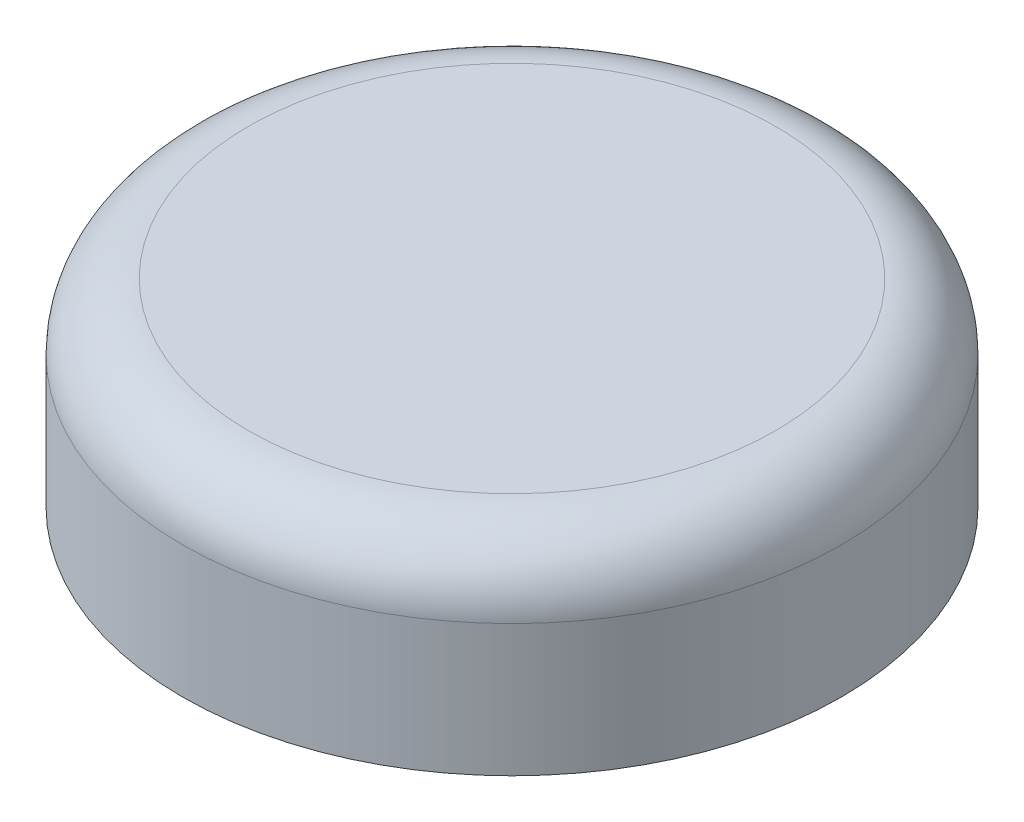
ISO-10303-21;
HEADER;
FILE_DESCRIPTION(('STEP AP214'),'2;1');
FILE_NAME('part.step','',(''),(''),'','','');
FILE_SCHEMA(('AUTOMOTIVE_DESIGN { 1 0 10303 214 1 1 1 1 }'));
ENDSEC;
DATA;
#1=APPLICATION_CONTEXT('core data for automotive mechanical design processes');
#2=APPLICATION_PROTOCOL_DEFINITION('international standard','automotive_design',2000,#1);
#3=PRODUCT_CONTEXT('',#1,'mechanical');
#4=PRODUCT('Part','Part','',(#3));
#5=PRODUCT_RELATED_PRODUCT_CATEGORY('part','',(#4));
#6=PRODUCT_DEFINITION_FORMATION('','',#4);
#7=PRODUCT_DEFINITION_CONTEXT('part definition',#1,'design');
#8=PRODUCT_DEFINITION('design','',#6,#7);
#9=PRODUCT_DEFINITION_SHAPE('','',#8);
#10=(LENGTH_UNIT() NAMED_UNIT(*) SI_UNIT(.MILLI.,.METRE.));
#11=(NAMED_UNIT(*) PLANE_ANGLE_UNIT() SI_UNIT($,.RADIAN.));
#12=(NAMED_UNIT(*) SI_UNIT($,.STERADIAN.) SOLID_ANGLE_UNIT());
#13=UNCERTAINTY_MEASURE_WITH_UNIT(LENGTH_MEASURE(1.E-05),#10,'distance_accuracy_value','');
#14=(GEOMETRIC_REPRESENTATION_CONTEXT(3) GLOBAL_UNCERTAINTY_ASSIGNED_CONTEXT((#13)) GLOBAL_UNIT_ASSIGNED_CONTEXT((#10,
#11,#12)) REPRESENTATION_CONTEXT('',''));
#15=CARTESIAN_POINT('',(0.,0.,0.));
#16=DIRECTION('',(0.,0.,1.));
#17=DIRECTION('',(1.,0.,0.));
#18=AXIS2_PLACEMENT_3D('',#15,#16,#17);
#19=CARTESIAN_POINT('',(0.,-4.5,0.));
#20=DIRECTION('',(0.,1.,0.));
#21=DIRECTION('',(0.,0.,1.));
#22=AXIS2_PLACEMENT_3D('',#19,#20,#21);
#23=CYLINDRICAL_SURFACE('',#22,2.4);
#24=DIRECTION('',(0.,-1.,0.));
#25=VECTOR('',#24,1.);
#26=CARTESIAN_POINT('',(-2.32379000772445,4.,-0.599999999999999));
#27=LINE('',#26,#25);
#28=CARTESIAN_POINT('',(-2.32379000772445,4.,-0.599999999999999));
#29=VERTEX_POINT('',#28);
#30=CARTESIAN_POINT('',(-2.32379000772445,-4.5,-0.599999999999999));
#31=VERTEX_POINT('',#30);
#32=EDGE_CURVE('E99',#29,#31,#27,.T.);
#33=ORIENTED_EDGE('',*,*,#32,.F.);
#34=CARTESIAN_POINT('',(0.,4.,0.));
#35=DIRECTION('',(0.,-1.,0.));
#36=DIRECTION('',(0.,0.,-1.));
#37=AXIS2_PLACEMENT_3D('',#34,#35,#36);
#38=CIRCLE('',#37,2.4);
#39=CARTESIAN_POINT('',(-0.599999999999999,4.,-2.32379000772445));
#40=VERTEX_POINT('',#39);
#41=EDGE_CURVE('E195',#29,#40,#38,.T.);
#42=ORIENTED_EDGE('',*,*,#41,.T.);
#43=DIRECTION('',(0.,-1.,0.));
#44=VECTOR('',#43,1.);
#45=CARTESIAN_POINT('',(-0.599999999999999,4.,-2.32379000772445));
#46=LINE('',#45,#44);
#47=CARTESIAN_POINT('',(-0.599999999999999,-4.5,-2.32379000772445));
#48=VERTEX_POINT('',#47);
#49=EDGE_CURVE('E163',#40,#48,#46,.T.);
#50=ORIENTED_EDGE('',*,*,#49,.T.);
#51=CARTESIAN_POINT('',(0.,-4.5,0.));
#52=DIRECTION('',(0.,-1.,0.));
#53=DIRECTION('',(0.,0.,-1.));
#54=AXIS2_PLACEMENT_3D('',#51,#52,#53);
#55=CIRCLE('',#54,2.4);
#56=EDGE_CURVE('E229',#31,#48,#55,.T.);
#57=ORIENTED_EDGE('',*,*,#56,.F.);
#58=EDGE_LOOP('',(#33,#42,#50,#57));
#59=FACE_BOUND('',#58,.T.);
#60=ADVANCED_FACE('F39',(#59),#23,.T.);
#61=CARTESIAN_POINT('',(-0.6,4.,2.32379000772445));
#62=VERTEX_POINT('',#61);
#63=CARTESIAN_POINT('',(-2.32379000772445,4.,0.600000000000001));
#64=VERTEX_POINT('',#63);
#65=EDGE_CURVE('E153',#62,#64,#38,.T.);
#66=ORIENTED_EDGE('',*,*,#65,.T.);
#67=DIRECTION('',(0.,-1.,0.));
#68=VECTOR('',#67,1.);
#69=CARTESIAN_POINT('',(-2.32379000772445,4.,0.600000000000001));
#70=LINE('',#69,#68);
#71=CARTESIAN_POINT('',(-2.32379000772445,-4.5,0.600000000000001));
#72=VERTEX_POINT('',#71);
#73=EDGE_CURVE('E143',#64,#72,#70,.T.);
#74=ORIENTED_EDGE('',*,*,#73,.T.);
#75=CARTESIAN_POINT('',(-0.6,-4.5,2.32379000772445));
#76=VERTEX_POINT('',#75);
#77=EDGE_CURVE('E335',#76,#72,#55,.T.);
#78=ORIENTED_EDGE('',*,*,#77,.F.);
#79=DIRECTION('',(0.,-1.,0.));
#80=VECTOR('',#79,1.);
#81=CARTESIAN_POINT('',(-0.6,4.,2.32379000772445));
#82=LINE('',#81,#80);
#83=EDGE_CURVE('E144',#62,#76,#82,.T.);
#84=ORIENTED_EDGE('',*,*,#83,.F.);
#85=EDGE_LOOP('',(#66,#74,#78,#84));
#86=FACE_BOUND('',#85,.T.);
#87=ADVANCED_FACE('F267',(#86),#23,.T.);
#88=DIRECTION('',(0.,-1.,0.));
#89=VECTOR('',#88,1.);
#90=CARTESIAN_POINT('',(2.32379000772445,4.,-0.599999999999999));
#91=LINE('',#90,#89);
#92=CARTESIAN_POINT('',(2.32379000772445,4.,-0.599999999999999));
#93=VERTEX_POINT('',#92);
#94=CARTESIAN_POINT('',(2.32379000772445,-4.5,-0.599999999999999));
#95=VERTEX_POINT('',#94);
#96=EDGE_CURVE('E210',#93,#95,#91,.T.);
#97=ORIENTED_EDGE('',*,*,#96,.T.);
#98=CARTESIAN_POINT('',(0.6,-4.5,-2.32379000772445));
#99=VERTEX_POINT('',#98);
#100=EDGE_CURVE('E223',#99,#95,#55,.T.);
#101=ORIENTED_EDGE('',*,*,#100,.F.);
#102=DIRECTION('',(0.,-1.,0.));
#103=VECTOR('',#102,1.);
#104=CARTESIAN_POINT('',(0.6,4.,-2.32379000772445));
#105=LINE('',#104,#103);
#106=CARTESIAN_POINT('',(0.6,4.,-2.32379000772445));
#107=VERTEX_POINT('',#106);
#108=EDGE_CURVE('E217',#107,#99,#105,.T.);
#109=ORIENTED_EDGE('',*,*,#108,.F.);
#110=EDGE_CURVE('E230',#107,#93,#38,.T.);
#111=ORIENTED_EDGE('',*,*,#110,.T.);
#112=EDGE_LOOP('',(#97,#101,#109,#111));
#113=FACE_BOUND('',#112,.T.);
#114=ADVANCED_FACE('F273',(#113),#23,.T.);
#115=CARTESIAN_POINT('',(0.,-4.5,0.));
#116=DIRECTION('',(0.,-1.,0.));
#117=DIRECTION('',(0.,0.,-1.));
#118=AXIS2_PLACEMENT_3D('',#115,#116,#117);
#119=PLANE('',#118);
#120=DIRECTION('',(-1.,0.,0.));
#121=VECTOR('',#120,1.);
#122=CARTESIAN_POINT('',(0.,-4.5,0.600000000000001));
#123=LINE('',#122,#121);
#124=CARTESIAN_POINT('',(-0.6,-4.5,0.600000000000001));
#125=VERTEX_POINT('',#124);
#126=EDGE_CURVE('E190',#125,#72,#123,.T.);
#127=ORIENTED_EDGE('',*,*,#126,.F.);
#128=DIRECTION('',(0.,0.,1.));
#129=VECTOR('',#128,1.);
#130=CARTESIAN_POINT('',(-0.6,-4.5,0.));
#131=LINE('',#130,#129);
#132=EDGE_CURVE('E138',#125,#76,#131,.T.);
#133=ORIENTED_EDGE('',*,*,#132,.T.);
#134=ORIENTED_EDGE('',*,*,#77,.T.);
#135=EDGE_LOOP('',(#127,#133,#134));
#136=FACE_BOUND('',#135,.T.);
#137=ADVANCED_FACE('F263',(#136),#119,.T.);
#138=ORIENTED_EDGE('',*,*,#100,.T.);
#139=DIRECTION('',(-1.,0.,0.));
#140=VECTOR('',#139,1.);
#141=CARTESIAN_POINT('',(0.,-4.5,-0.599999999999999));
#142=LINE('',#141,#140);
#143=CARTESIAN_POINT('',(0.6,-4.5,-0.599999999999999));
#144=VERTEX_POINT('',#143);
#145=EDGE_CURVE('E177',#95,#144,#142,.T.);
#146=ORIENTED_EDGE('',*,*,#145,.T.);
#147=DIRECTION('',(0.,0.,1.));
#148=VECTOR('',#147,1.);
#149=CARTESIAN_POINT('',(0.6,-4.5,0.));
#150=LINE('',#149,#148);
#151=EDGE_CURVE('E173',#99,#144,#150,.T.);
#152=ORIENTED_EDGE('',*,*,#151,.F.);
#153=EDGE_LOOP('',(#138,#146,#152));
#154=FACE_BOUND('',#153,.T.);
#155=ADVANCED_FACE('F289',(#154),#119,.T.);
#156=DIRECTION('',(0.,0.,1.));
#157=VECTOR('',#156,1.);
#158=CARTESIAN_POINT('',(-0.6,-4.5,0.));
#159=LINE('',#158,#157);
#160=CARTESIAN_POINT('',(-0.6,-4.5,-0.599999999999999));
#161=VERTEX_POINT('',#160);
#162=EDGE_CURVE('E169',#48,#161,#159,.T.);
#163=ORIENTED_EDGE('',*,*,#162,.T.);
#164=DIRECTION('',(-1.,0.,0.));
#165=VECTOR('',#164,1.);
#166=CARTESIAN_POINT('',(0.,-4.5,-0.599999999999999));
#167=LINE('',#166,#165);
#168=EDGE_CURVE('E55',#161,#31,#167,.T.);
#169=ORIENTED_EDGE('',*,*,#168,.T.);
#170=ORIENTED_EDGE('',*,*,#56,.T.);
#171=EDGE_LOOP('',(#163,#169,#170));
#172=FACE_BOUND('',#171,.T.);
#173=ADVANCED_FACE('F264',(#172),#119,.T.);
#174=CARTESIAN_POINT('',(0.,6.,0.));
#175=DIRECTION('',(0.,-1.,0.));
#176=DIRECTION('',(0.,0.,-1.));
#177=AXIS2_PLACEMENT_3D('',#174,#175,#176);
#178=CYLINDRICAL_SURFACE('',#177,10.);
#179=CARTESIAN_POINT('',(0.,4.,0.));
#180=DIRECTION('',(0.,1.,0.));
#181=DIRECTION('',(0.,0.,1.));
#182=AXIS2_PLACEMENT_3D('',#179,#180,#181);
#183=CIRCLE('',#182,10.);
#184=CARTESIAN_POINT('',(0.,4.,10.));
#185=VERTEX_POINT('',#184);
#186=EDGE_CURVE('E11',#185,#185,#183,.F.);
#187=ORIENTED_EDGE('',*,*,#186,.T.);
#188=EDGE_LOOP('',(#187));
#189=FACE_BOUND('',#188,.T.);
#190=CARTESIAN_POINT('',(0.,0.,0.));
#191=DIRECTION('',(0.,1.,0.));
#192=DIRECTION('',(0.,0.,1.));
#193=AXIS2_PLACEMENT_3D('',#190,#191,#192);
#194=CIRCLE('',#193,10.);
#195=CARTESIAN_POINT('',(0.,0.,10.));
#196=VERTEX_POINT('',#195);
#197=EDGE_CURVE('E239',#196,#196,#194,.T.);
#198=ORIENTED_EDGE('',*,*,#197,.T.);
#199=EDGE_LOOP('',(#198));
#200=FACE_BOUND('',#199,.T.);
#201=ADVANCED_FACE('F365',(#189,#200),#178,.T.);
#202=CARTESIAN_POINT('',(0.,6.,0.));
#203=DIRECTION('',(0.,1.,0.));
#204=DIRECTION('',(0.,0.,1.));
#205=AXIS2_PLACEMENT_3D('',#202,#203,#204);
#206=PLANE('',#205);
#207=CARTESIAN_POINT('',(0.,6.,0.));
#208=DIRECTION('',(0.,1.,0.));
#209=DIRECTION('',(0.,0.,1.));
#210=AXIS2_PLACEMENT_3D('',#207,#208,#209);
#211=CIRCLE('',#210,8.);
#212=CARTESIAN_POINT('',(0.,6.,8.));
#213=VERTEX_POINT('',#212);
#214=EDGE_CURVE('E48',#213,#213,#211,.T.);
#215=ORIENTED_EDGE('',*,*,#214,.T.);
#216=EDGE_LOOP('',(#215));
#217=FACE_BOUND('',#216,.T.);
#218=ADVANCED_FACE('F249',(#217),#206,.T.);
#219=CARTESIAN_POINT('',(0.,0.,0.));
#220=DIRECTION('',(0.,1.,0.));
#221=DIRECTION('',(0.,0.,1.));
#222=AXIS2_PLACEMENT_3D('',#219,#220,#221);
#223=PLANE('',#222);
#224=CARTESIAN_POINT('',(0.,0.,0.));
#225=DIRECTION('',(0.,-1.,0.));
#226=DIRECTION('',(0.,0.,-1.));
#227=AXIS2_PLACEMENT_3D('',#224,#225,#226);
#228=CIRCLE('',#227,9.);
#229=CARTESIAN_POINT('',(0.,0.,-9.));
#230=VERTEX_POINT('',#229);
#231=EDGE_CURVE('E227',#230,#230,#228,.T.);
#232=ORIENTED_EDGE('',*,*,#231,.F.);
#233=EDGE_LOOP('',(#232));
#234=FACE_BOUND('',#233,.T.);
#235=ORIENTED_EDGE('',*,*,#197,.F.);
#236=EDGE_LOOP('',(#235));
#237=FACE_BOUND('',#236,.T.);
#238=ADVANCED_FACE('F407',(#234,#237),#223,.F.);
#239=CARTESIAN_POINT('',(0.,4.,0.));
#240=DIRECTION('',(0.,-1.,0.));
#241=DIRECTION('',(0.,0.,-1.));
#242=AXIS2_PLACEMENT_3D('',#239,#240,#241);
#243=CYLINDRICAL_SURFACE('',#242,9.);
#244=CARTESIAN_POINT('',(0.,4.,0.));
#245=DIRECTION('',(0.,-1.,0.));
#246=DIRECTION('',(0.,0.,-1.));
#247=AXIS2_PLACEMENT_3D('',#244,#245,#246);
#248=CIRCLE('',#247,9.);
#249=CARTESIAN_POINT('',(0.,4.,-9.));
#250=VERTEX_POINT('',#249);
#251=EDGE_CURVE('E235',#250,#250,#248,.T.);
#252=ORIENTED_EDGE('',*,*,#251,.F.);
#253=EDGE_LOOP('',(#252));
#254=FACE_BOUND('',#253,.T.);
#255=ORIENTED_EDGE('',*,*,#231,.T.);
#256=EDGE_LOOP('',(#255));
#257=FACE_BOUND('',#256,.T.);
#258=ADVANCED_FACE('F281',(#254,#257),#243,.F.);
#259=CARTESIAN_POINT('',(0.,4.,0.));
#260=DIRECTION('',(0.,-1.,0.));
#261=DIRECTION('',(0.,0.,-1.));
#262=AXIS2_PLACEMENT_3D('',#259,#260,#261);
#263=PLANE('',#262);
#264=CARTESIAN_POINT('',(2.32379000772445,4.,0.600000000000001));
#265=VERTEX_POINT('',#264);
#266=CARTESIAN_POINT('',(0.6,4.,2.32379000772445));
#267=VERTEX_POINT('',#266);
#268=EDGE_CURVE('E234',#265,#267,#38,.T.);
#269=ORIENTED_EDGE('',*,*,#268,.F.);
#270=DIRECTION('',(-1.,0.,0.));
#271=VECTOR('',#270,1.);
#272=CARTESIAN_POINT('',(0.,4.,0.600000000000001));
#273=LINE('',#272,#271);
#274=CARTESIAN_POINT('',(0.6,4.,0.600000000000001));
#275=VERTEX_POINT('',#274);
#276=EDGE_CURVE('E307',#265,#275,#273,.T.);
#277=ORIENTED_EDGE('',*,*,#276,.T.);
#278=DIRECTION('',(0.,0.,1.));
#279=VECTOR('',#278,1.);
#280=CARTESIAN_POINT('',(0.6,4.,0.));
#281=LINE('',#280,#279);
#282=EDGE_CURVE('E155',#275,#267,#281,.T.);
#283=ORIENTED_EDGE('',*,*,#282,.T.);
#284=EDGE_LOOP('',(#269,#277,#283));
#285=FACE_BOUND('',#284,.T.);
#286=ORIENTED_EDGE('',*,*,#65,.F.);
#287=DIRECTION('',(0.,0.,1.));
#288=VECTOR('',#287,1.);
#289=CARTESIAN_POINT('',(-0.6,4.,0.));
#290=LINE('',#289,#288);
#291=CARTESIAN_POINT('',(-0.6,4.,0.600000000000001));
#292=VERTEX_POINT('',#291);
#293=EDGE_CURVE('E135',#292,#62,#290,.T.);
#294=ORIENTED_EDGE('',*,*,#293,.F.);
#295=DIRECTION('',(-1.,0.,0.));
#296=VECTOR('',#295,1.);
#297=CARTESIAN_POINT('',(0.,4.,0.600000000000001));
#298=LINE('',#297,#296);
#299=EDGE_CURVE('E151',#292,#64,#298,.T.);
#300=ORIENTED_EDGE('',*,*,#299,.T.);
#301=EDGE_LOOP('',(#286,#294,#300));
#302=FACE_BOUND('',#301,.T.);
#303=ORIENTED_EDGE('',*,*,#41,.F.);
#304=DIRECTION('',(-1.,0.,0.));
#305=VECTOR('',#304,1.);
#306=CARTESIAN_POINT('',(0.,4.,-0.599999999999999));
#307=LINE('',#306,#305);
#308=CARTESIAN_POINT('',(-0.6,4.,-0.599999999999999));
#309=VERTEX_POINT('',#308);
#310=EDGE_CURVE('E61',#309,#29,#307,.T.);
#311=ORIENTED_EDGE('',*,*,#310,.F.);
#312=DIRECTION('',(0.,0.,1.));
#313=VECTOR('',#312,1.);
#314=CARTESIAN_POINT('',(-0.6,4.,0.));
#315=LINE('',#314,#313);
#316=EDGE_CURVE('E106',#40,#309,#315,.T.);
#317=ORIENTED_EDGE('',*,*,#316,.F.);
#318=EDGE_LOOP('',(#303,#311,#317));
#319=FACE_BOUND('',#318,.T.);
#320=ORIENTED_EDGE('',*,*,#110,.F.);
#321=DIRECTION('',(0.,0.,1.));
#322=VECTOR('',#321,1.);
#323=CARTESIAN_POINT('',(0.6,4.,0.));
#324=LINE('',#323,#322);
#325=CARTESIAN_POINT('',(0.6,4.,-0.599999999999999));
#326=VERTEX_POINT('',#325);
#327=EDGE_CURVE('E302',#107,#326,#324,.T.);
#328=ORIENTED_EDGE('',*,*,#327,.T.);
#329=DIRECTION('',(-1.,0.,0.));
#330=VECTOR('',#329,1.);
#331=CARTESIAN_POINT('',(0.,4.,-0.599999999999999));
#332=LINE('',#331,#330);
#333=EDGE_CURVE('E305',#93,#326,#332,.T.);
#334=ORIENTED_EDGE('',*,*,#333,.F.);
#335=EDGE_LOOP('',(#320,#328,#334));
#336=FACE_BOUND('',#335,.T.);
#337=ORIENTED_EDGE('',*,*,#251,.T.);
#338=EDGE_LOOP('',(#337));
#339=FACE_BOUND('',#338,.T.);
#340=ADVANCED_FACE('F149',(#285,#302,#319,#336,#339),#263,.T.);
#341=ORIENTED_EDGE('',*,*,#268,.T.);
#342=DIRECTION('',(0.,-1.,0.));
#343=VECTOR('',#342,1.);
#344=CARTESIAN_POINT('',(0.6,4.,2.32379000772445));
#345=LINE('',#344,#343);
#346=CARTESIAN_POINT('',(0.6,-4.5,2.32379000772445));
#347=VERTEX_POINT('',#346);
#348=EDGE_CURVE('E200',#267,#347,#345,.T.);
#349=ORIENTED_EDGE('',*,*,#348,.T.);
#350=CARTESIAN_POINT('',(2.32379000772445,-4.5,0.600000000000001));
#351=VERTEX_POINT('',#350);
#352=EDGE_CURVE('E228',#351,#347,#55,.T.);
#353=ORIENTED_EDGE('',*,*,#352,.F.);
#354=DIRECTION('',(0.,-1.,0.));
#355=VECTOR('',#354,1.);
#356=CARTESIAN_POINT('',(2.32379000772445,4.,0.600000000000001));
#357=LINE('',#356,#355);
#358=EDGE_CURVE('E207',#265,#351,#357,.T.);
#359=ORIENTED_EDGE('',*,*,#358,.F.);
#360=EDGE_LOOP('',(#341,#349,#353,#359));
#361=FACE_BOUND('',#360,.T.);
#362=ADVANCED_FACE('F260',(#361),#23,.T.);
#363=DIRECTION('',(0.,0.,1.));
#364=VECTOR('',#363,1.);
#365=CARTESIAN_POINT('',(0.6,-4.5,0.));
#366=LINE('',#365,#364);
#367=CARTESIAN_POINT('',(0.6,-4.5,0.600000000000001));
#368=VERTEX_POINT('',#367);
#369=EDGE_CURVE('E185',#368,#347,#366,.T.);
#370=ORIENTED_EDGE('',*,*,#369,.F.);
#371=DIRECTION('',(-1.,0.,0.));
#372=VECTOR('',#371,1.);
#373=CARTESIAN_POINT('',(0.,-4.5,0.600000000000001));
#374=LINE('',#373,#372);
#375=EDGE_CURVE('E181',#351,#368,#374,.T.);
#376=ORIENTED_EDGE('',*,*,#375,.F.);
#377=ORIENTED_EDGE('',*,*,#352,.T.);
#378=EDGE_LOOP('',(#370,#376,#377));
#379=FACE_BOUND('',#378,.T.);
#380=ADVANCED_FACE('F253',(#379),#119,.T.);
#381=CARTESIAN_POINT('',(0.,4.,0.));
#382=DIRECTION('',(0.,1.,0.));
#383=DIRECTION('',(0.,0.,1.));
#384=AXIS2_PLACEMENT_3D('',#381,#382,#383);
#385=TOROIDAL_SURFACE('',#384,8.,2.);
#386=ORIENTED_EDGE('',*,*,#186,.F.);
#387=EDGE_LOOP('',(#386));
#388=FACE_BOUND('',#387,.T.);
#389=ORIENTED_EDGE('',*,*,#214,.F.);
#390=EDGE_LOOP('',(#389));
#391=FACE_BOUND('',#390,.T.);
#392=ADVANCED_FACE('F41',(#388,#391),#385,.T.);
#393=CARTESIAN_POINT('',(0.,4.,-0.599999999999999));
#394=DIRECTION('',(0.,0.,1.));
#395=DIRECTION('',(1.,0.,0.));
#396=AXIS2_PLACEMENT_3D('',#393,#394,#395);
#397=PLANE('',#396);
#398=ORIENTED_EDGE('',*,*,#168,.F.);
#399=DIRECTION('',(0.,-1.,0.));
#400=VECTOR('',#399,1.);
#401=CARTESIAN_POINT('',(-0.6,4.,-0.599999999999999));
#402=LINE('',#401,#400);
#403=EDGE_CURVE('E160',#309,#161,#402,.T.);
#404=ORIENTED_EDGE('',*,*,#403,.F.);
#405=ORIENTED_EDGE('',*,*,#310,.T.);
#406=ORIENTED_EDGE('',*,*,#32,.T.);
#407=EDGE_LOOP('',(#398,#404,#405,#406));
#408=FACE_BOUND('',#407,.T.);
#409=ADVANCED_FACE('F252',(#408),#397,.T.);
#410=CARTESIAN_POINT('',(0.,4.,0.600000000000001));
#411=DIRECTION('',(0.,0.,1.));
#412=DIRECTION('',(1.,0.,0.));
#413=AXIS2_PLACEMENT_3D('',#410,#411,#412);
#414=PLANE('',#413);
#415=ORIENTED_EDGE('',*,*,#126,.T.);
#416=ORIENTED_EDGE('',*,*,#73,.F.);
#417=ORIENTED_EDGE('',*,*,#299,.F.);
#418=DIRECTION('',(0.,-1.,0.));
#419=VECTOR('',#418,1.);
#420=CARTESIAN_POINT('',(-0.6,4.,0.600000000000001));
#421=LINE('',#420,#419);
#422=EDGE_CURVE('E132',#292,#125,#421,.T.);
#423=ORIENTED_EDGE('',*,*,#422,.T.);
#424=EDGE_LOOP('',(#415,#416,#417,#423));
#425=FACE_BOUND('',#424,.T.);
#426=ADVANCED_FACE('F157',(#425),#414,.F.);
#427=CARTESIAN_POINT('',(-0.6,4.,0.));
#428=DIRECTION('',(1.,0.,0.));
#429=DIRECTION('',(0.,0.,-1.));
#430=AXIS2_PLACEMENT_3D('',#427,#428,#429);
#431=PLANE('',#430);
#432=ORIENTED_EDGE('',*,*,#132,.F.);
#433=ORIENTED_EDGE('',*,*,#422,.F.);
#434=ORIENTED_EDGE('',*,*,#293,.T.);
#435=ORIENTED_EDGE('',*,*,#83,.T.);
#436=EDGE_LOOP('',(#432,#433,#434,#435));
#437=FACE_BOUND('',#436,.T.);
#438=ADVANCED_FACE('F134',(#437),#431,.T.);
#439=CARTESIAN_POINT('',(0.6,4.,0.));
#440=DIRECTION('',(1.,0.,0.));
#441=DIRECTION('',(0.,0.,-1.));
#442=AXIS2_PLACEMENT_3D('',#439,#440,#441);
#443=PLANE('',#442);
#444=ORIENTED_EDGE('',*,*,#369,.T.);
#445=ORIENTED_EDGE('',*,*,#348,.F.);
#446=ORIENTED_EDGE('',*,*,#282,.F.);
#447=DIRECTION('',(0.,-1.,0.));
#448=VECTOR('',#447,1.);
#449=CARTESIAN_POINT('',(0.6,4.,0.600000000000001));
#450=LINE('',#449,#448);
#451=EDGE_CURVE('E204',#275,#368,#450,.T.);
#452=ORIENTED_EDGE('',*,*,#451,.T.);
#453=EDGE_LOOP('',(#444,#445,#446,#452));
#454=FACE_BOUND('',#453,.T.);
#455=ADVANCED_FACE('F344',(#454),#443,.F.);
#456=CARTESIAN_POINT('',(0.,4.,0.600000000000001));
#457=DIRECTION('',(0.,0.,1.));
#458=DIRECTION('',(1.,0.,0.));
#459=AXIS2_PLACEMENT_3D('',#456,#457,#458);
#460=PLANE('',#459);
#461=ORIENTED_EDGE('',*,*,#375,.T.);
#462=ORIENTED_EDGE('',*,*,#451,.F.);
#463=ORIENTED_EDGE('',*,*,#276,.F.);
#464=ORIENTED_EDGE('',*,*,#358,.T.);
#465=EDGE_LOOP('',(#461,#462,#463,#464));
#466=FACE_BOUND('',#465,.T.);
#467=ADVANCED_FACE('F343',(#466),#460,.F.);
#468=CARTESIAN_POINT('',(0.,4.,-0.599999999999999));
#469=DIRECTION('',(0.,0.,1.));
#470=DIRECTION('',(1.,0.,0.));
#471=AXIS2_PLACEMENT_3D('',#468,#469,#470);
#472=PLANE('',#471);
#473=ORIENTED_EDGE('',*,*,#145,.F.);
#474=ORIENTED_EDGE('',*,*,#96,.F.);
#475=ORIENTED_EDGE('',*,*,#333,.T.);
#476=DIRECTION('',(0.,-1.,0.));
#477=VECTOR('',#476,1.);
#478=CARTESIAN_POINT('',(0.6,4.,-0.599999999999999));
#479=LINE('',#478,#477);
#480=EDGE_CURVE('E214',#326,#144,#479,.T.);
#481=ORIENTED_EDGE('',*,*,#480,.T.);
#482=EDGE_LOOP('',(#473,#474,#475,#481));
#483=FACE_BOUND('',#482,.T.);
#484=ADVANCED_FACE('F351',(#483),#472,.T.);
#485=CARTESIAN_POINT('',(0.6,4.,0.));
#486=DIRECTION('',(1.,0.,0.));
#487=DIRECTION('',(0.,0.,-1.));
#488=AXIS2_PLACEMENT_3D('',#485,#486,#487);
#489=PLANE('',#488);
#490=ORIENTED_EDGE('',*,*,#151,.T.);
#491=ORIENTED_EDGE('',*,*,#480,.F.);
#492=ORIENTED_EDGE('',*,*,#327,.F.);
#493=ORIENTED_EDGE('',*,*,#108,.T.);
#494=EDGE_LOOP('',(#490,#491,#492,#493));
#495=FACE_BOUND('',#494,.T.);
#496=ADVANCED_FACE('F300',(#495),#489,.F.);
#497=CARTESIAN_POINT('',(-0.6,4.,0.));
#498=DIRECTION('',(1.,0.,0.));
#499=DIRECTION('',(0.,0.,-1.));
#500=AXIS2_PLACEMENT_3D('',#497,#498,#499);
#501=PLANE('',#500);
#502=ORIENTED_EDGE('',*,*,#162,.F.);
#503=ORIENTED_EDGE('',*,*,#49,.F.);
#504=ORIENTED_EDGE('',*,*,#316,.T.);
#505=ORIENTED_EDGE('',*,*,#403,.T.);
#506=EDGE_LOOP('',(#502,#503,#504,#505));
#507=FACE_BOUND('',#506,.T.);
#508=ADVANCED_FACE('F360',(#507),#501,.T.);
#509=CLOSED_SHELL('',(#60,#87,#114,#137,#155,#173,#201,#218,#238,#258,#340,#362,#380,#392,#409,
#426,#438,#455,#467,#484,#496,#508));
#510=MANIFOLD_SOLID_BREP('B2',#509);
#511=ADVANCED_BREP_SHAPE_REPRESENTATION('',(#18,#510),#14);
#512=SHAPE_DEFINITION_REPRESENTATION(#9,#511);
ENDSEC;
END-ISO-10303-21;
